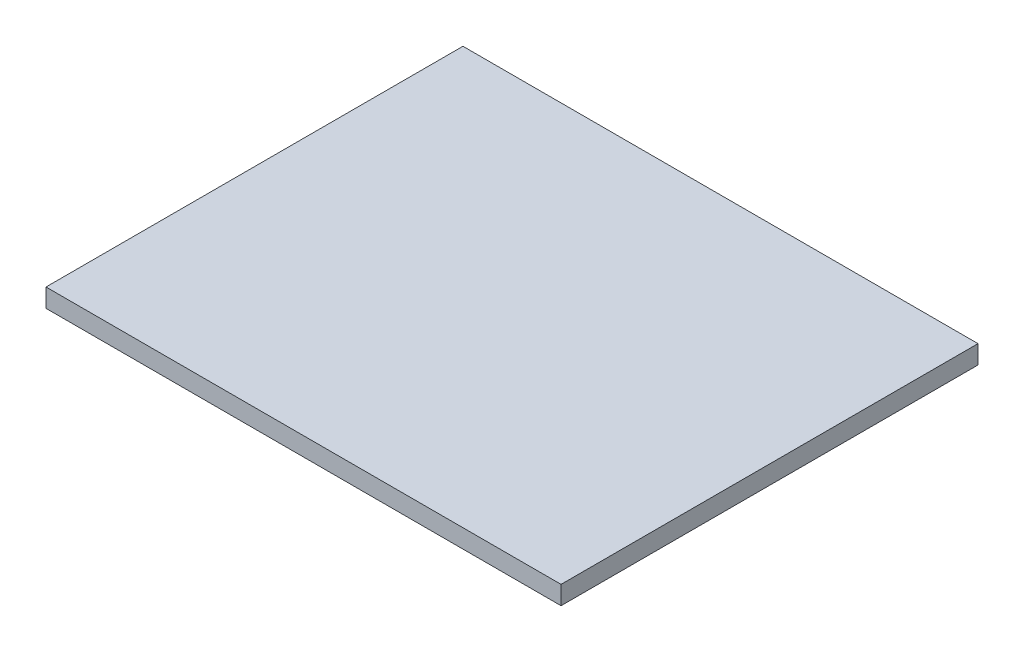
ISO-10303-21;
HEADER;
FILE_DESCRIPTION(('STEP AP214'),'2;1');
FILE_NAME('part.step','',(''),(''),'','','');
FILE_SCHEMA(('AUTOMOTIVE_DESIGN { 1 0 10303 214 1 1 1 1 }'));
ENDSEC;
DATA;
#1=APPLICATION_CONTEXT('core data for automotive mechanical design processes');
#2=APPLICATION_PROTOCOL_DEFINITION('international standard','automotive_design',2000,#1);
#3=PRODUCT_CONTEXT('',#1,'mechanical');
#4=PRODUCT('Part','Part','',(#3));
#5=PRODUCT_RELATED_PRODUCT_CATEGORY('part','',(#4));
#6=PRODUCT_DEFINITION_FORMATION('','',#4);
#7=PRODUCT_DEFINITION_CONTEXT('part definition',#1,'design');
#8=PRODUCT_DEFINITION('design','',#6,#7);
#9=PRODUCT_DEFINITION_SHAPE('','',#8);
#10=(LENGTH_UNIT() NAMED_UNIT(*) SI_UNIT(.MILLI.,.METRE.));
#11=(NAMED_UNIT(*) PLANE_ANGLE_UNIT() SI_UNIT($,.RADIAN.));
#12=(NAMED_UNIT(*) SI_UNIT($,.STERADIAN.) SOLID_ANGLE_UNIT());
#13=UNCERTAINTY_MEASURE_WITH_UNIT(LENGTH_MEASURE(1.E-05),#10,'distance_accuracy_value','');
#14=(GEOMETRIC_REPRESENTATION_CONTEXT(3) GLOBAL_UNCERTAINTY_ASSIGNED_CONTEXT((#13)) GLOBAL_UNIT_ASSIGNED_CONTEXT((#10,
#11,#12)) REPRESENTATION_CONTEXT('',''));
#15=CARTESIAN_POINT('',(0.,0.,0.));
#16=DIRECTION('',(0.,0.,1.));
#17=DIRECTION('',(1.,0.,0.));
#18=AXIS2_PLACEMENT_3D('',#15,#16,#17);
#19=CARTESIAN_POINT('',(-45.7926645852597,7.2136,-36.9171322926299));
#20=DIRECTION('',(1.,0.,0.));
#21=DIRECTION('',(0.,0.,-1.));
#22=AXIS2_PLACEMENT_3D('',#19,#20,#21);
#23=PLANE('',#22);
#24=DIRECTION('',(0.,0.,1.));
#25=VECTOR('',#24,1.);
#26=CARTESIAN_POINT('',(-45.7926645852597,0.,-36.9171322926299));
#27=LINE('',#26,#25);
#28=CARTESIAN_POINT('',(-45.7926645852597,0.,-36.9171322926299));
#29=VERTEX_POINT('',#28);
#30=CARTESIAN_POINT('',(-45.7926645852597,0.,125.43966770737));
#31=VERTEX_POINT('',#30);
#32=EDGE_CURVE('E96',#29,#31,#27,.T.);
#33=ORIENTED_EDGE('',*,*,#32,.T.);
#34=DIRECTION('',(0.,-1.,0.));
#35=VECTOR('',#34,1.);
#36=CARTESIAN_POINT('',(-45.7926645852597,7.2136,125.43966770737));
#37=LINE('',#36,#35);
#38=CARTESIAN_POINT('',(-45.7926645852597,7.2136,125.43966770737));
#39=VERTEX_POINT('',#38);
#40=EDGE_CURVE('E11',#39,#31,#37,.T.);
#41=ORIENTED_EDGE('',*,*,#40,.F.);
#42=DIRECTION('',(0.,0.,1.));
#43=VECTOR('',#42,1.);
#44=CARTESIAN_POINT('',(-45.7926645852597,7.2136,-36.9171322926299));
#45=LINE('',#44,#43);
#46=CARTESIAN_POINT('',(-45.7926645852597,7.2136,-36.9171322926299));
#47=VERTEX_POINT('',#46);
#48=EDGE_CURVE('E84',#47,#39,#45,.T.);
#49=ORIENTED_EDGE('',*,*,#48,.F.);
#50=DIRECTION('',(0.,-1.,0.));
#51=VECTOR('',#50,1.);
#52=CARTESIAN_POINT('',(-45.7926645852597,7.2136,-36.9171322926299));
#53=LINE('',#52,#51);
#54=EDGE_CURVE('E92',#47,#29,#53,.T.);
#55=ORIENTED_EDGE('',*,*,#54,.T.);
#56=EDGE_LOOP('',(#33,#41,#49,#55));
#57=FACE_BOUND('',#56,.T.);
#58=ADVANCED_FACE('F33',(#57),#23,.F.);
#59=CARTESIAN_POINT('',(-45.7926645852597,7.2136,125.43966770737));
#60=DIRECTION('',(0.,0.,-1.));
#61=DIRECTION('',(-1.,0.,0.));
#62=AXIS2_PLACEMENT_3D('',#59,#60,#61);
#63=PLANE('',#62);
#64=DIRECTION('',(1.,0.,0.));
#65=VECTOR('',#64,1.);
#66=CARTESIAN_POINT('',(-45.7926645852597,0.,125.43966770737));
#67=LINE('',#66,#65);
#68=CARTESIAN_POINT('',(154.76573541474,0.,125.43966770737));
#69=VERTEX_POINT('',#68);
#70=EDGE_CURVE('E88',#31,#69,#67,.T.);
#71=ORIENTED_EDGE('',*,*,#70,.T.);
#72=DIRECTION('',(0.,-1.,0.));
#73=VECTOR('',#72,1.);
#74=CARTESIAN_POINT('',(154.76573541474,7.2136,125.43966770737));
#75=LINE('',#74,#73);
#76=CARTESIAN_POINT('',(154.76573541474,7.2136,125.43966770737));
#77=VERTEX_POINT('',#76);
#78=EDGE_CURVE('E41',#77,#69,#75,.T.);
#79=ORIENTED_EDGE('',*,*,#78,.F.);
#80=DIRECTION('',(1.,0.,0.));
#81=VECTOR('',#80,1.);
#82=CARTESIAN_POINT('',(-45.7926645852597,7.2136,125.43966770737));
#83=LINE('',#82,#81);
#84=EDGE_CURVE('E79',#39,#77,#83,.T.);
#85=ORIENTED_EDGE('',*,*,#84,.F.);
#86=ORIENTED_EDGE('',*,*,#40,.T.);
#87=EDGE_LOOP('',(#71,#79,#85,#86));
#88=FACE_BOUND('',#87,.T.);
#89=ADVANCED_FACE('F87',(#88),#63,.F.);
#90=CARTESIAN_POINT('',(154.76573541474,7.2136,-36.9171322926299));
#91=DIRECTION('',(-1.,0.,0.));
#92=DIRECTION('',(0.,0.,1.));
#93=AXIS2_PLACEMENT_3D('',#90,#91,#92);
#94=PLANE('',#93);
#95=DIRECTION('',(0.,0.,-1.));
#96=VECTOR('',#95,1.);
#97=CARTESIAN_POINT('',(154.76573541474,0.,-36.9171322926299));
#98=LINE('',#97,#96);
#99=CARTESIAN_POINT('',(154.76573541474,0.,-36.9171322926299));
#100=VERTEX_POINT('',#99);
#101=EDGE_CURVE('E66',#69,#100,#98,.T.);
#102=ORIENTED_EDGE('',*,*,#101,.T.);
#103=DIRECTION('',(0.,-1.,0.));
#104=VECTOR('',#103,1.);
#105=CARTESIAN_POINT('',(154.76573541474,7.2136,-36.9171322926299));
#106=LINE('',#105,#104);
#107=CARTESIAN_POINT('',(154.76573541474,7.2136,-36.9171322926299));
#108=VERTEX_POINT('',#107);
#109=EDGE_CURVE('E89',#108,#100,#106,.T.);
#110=ORIENTED_EDGE('',*,*,#109,.F.);
#111=DIRECTION('',(0.,0.,-1.));
#112=VECTOR('',#111,1.);
#113=CARTESIAN_POINT('',(154.76573541474,7.2136,-36.9171322926299));
#114=LINE('',#113,#112);
#115=EDGE_CURVE('E82',#77,#108,#114,.T.);
#116=ORIENTED_EDGE('',*,*,#115,.F.);
#117=ORIENTED_EDGE('',*,*,#78,.T.);
#118=EDGE_LOOP('',(#102,#110,#116,#117));
#119=FACE_BOUND('',#118,.T.);
#120=ADVANCED_FACE('F90',(#119),#94,.F.);
#121=CARTESIAN_POINT('',(-45.7926645852597,7.2136,-36.9171322926299));
#122=DIRECTION('',(0.,0.,1.));
#123=DIRECTION('',(1.,0.,0.));
#124=AXIS2_PLACEMENT_3D('',#121,#122,#123);
#125=PLANE('',#124);
#126=DIRECTION('',(-1.,0.,0.));
#127=VECTOR('',#126,1.);
#128=CARTESIAN_POINT('',(-45.7926645852597,0.,-36.9171322926299));
#129=LINE('',#128,#127);
#130=EDGE_CURVE('E72',#100,#29,#129,.T.);
#131=ORIENTED_EDGE('',*,*,#130,.T.);
#132=ORIENTED_EDGE('',*,*,#54,.F.);
#133=DIRECTION('',(-1.,0.,0.));
#134=VECTOR('',#133,1.);
#135=CARTESIAN_POINT('',(-45.7926645852597,7.2136,-36.9171322926299));
#136=LINE('',#135,#134);
#137=EDGE_CURVE('E49',#108,#47,#136,.T.);
#138=ORIENTED_EDGE('',*,*,#137,.F.);
#139=ORIENTED_EDGE('',*,*,#109,.T.);
#140=EDGE_LOOP('',(#131,#132,#138,#139));
#141=FACE_BOUND('',#140,.T.);
#142=ADVANCED_FACE('F103',(#141),#125,.F.);
#143=CARTESIAN_POINT('',(0.,7.2136,0.));
#144=DIRECTION('',(0.,1.,0.));
#145=DIRECTION('',(0.,0.,1.));
#146=AXIS2_PLACEMENT_3D('',#143,#144,#145);
#147=PLANE('',#146);
#148=ORIENTED_EDGE('',*,*,#48,.T.);
#149=ORIENTED_EDGE('',*,*,#84,.T.);
#150=ORIENTED_EDGE('',*,*,#115,.T.);
#151=ORIENTED_EDGE('',*,*,#137,.T.);
#152=EDGE_LOOP('',(#148,#149,#150,#151));
#153=FACE_BOUND('',#152,.T.);
#154=ADVANCED_FACE('F80',(#153),#147,.T.);
#155=CARTESIAN_POINT('',(0.,0.,0.));
#156=DIRECTION('',(0.,1.,0.));
#157=DIRECTION('',(0.,0.,1.));
#158=AXIS2_PLACEMENT_3D('',#155,#156,#157);
#159=PLANE('',#158);
#160=ORIENTED_EDGE('',*,*,#32,.F.);
#161=ORIENTED_EDGE('',*,*,#130,.F.);
#162=ORIENTED_EDGE('',*,*,#101,.F.);
#163=ORIENTED_EDGE('',*,*,#70,.F.);
#164=EDGE_LOOP('',(#160,#161,#162,#163));
#165=FACE_BOUND('',#164,.T.);
#166=ADVANCED_FACE('F106',(#165),#159,.F.);
#167=CLOSED_SHELL('',(#58,#89,#120,#142,#154,#166));
#168=MANIFOLD_SOLID_BREP('B2',#167);
#169=ADVANCED_BREP_SHAPE_REPRESENTATION('',(#18,#168),#14);
#170=SHAPE_DEFINITION_REPRESENTATION(#9,#169);
ENDSEC;
END-ISO-10303-21;
